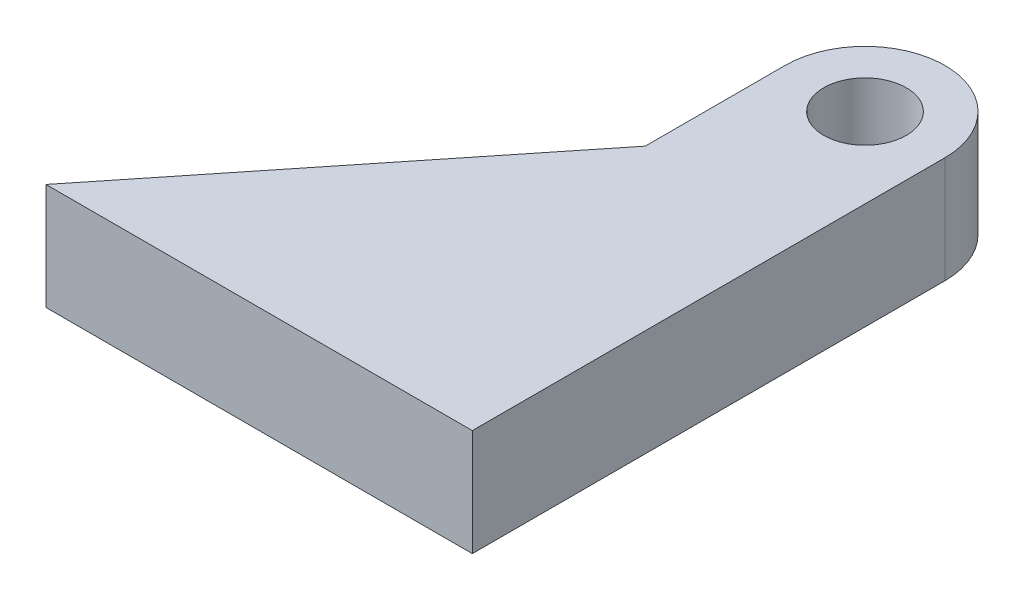
ISO-10303-21;
HEADER;
FILE_DESCRIPTION(('STEP AP214'),'2;1');
FILE_NAME('part.step','',(''),(''),'','','');
FILE_SCHEMA(('AUTOMOTIVE_DESIGN { 1 0 10303 214 1 1 1 1 }'));
ENDSEC;
DATA;
#1=APPLICATION_CONTEXT('core data for automotive mechanical design processes');
#2=APPLICATION_PROTOCOL_DEFINITION('international standard','automotive_design',2000,#1);
#3=PRODUCT_CONTEXT('',#1,'mechanical');
#4=PRODUCT('Part','Part','',(#3));
#5=PRODUCT_RELATED_PRODUCT_CATEGORY('part','',(#4));
#6=PRODUCT_DEFINITION_FORMATION('','',#4);
#7=PRODUCT_DEFINITION_CONTEXT('part definition',#1,'design');
#8=PRODUCT_DEFINITION('design','',#6,#7);
#9=PRODUCT_DEFINITION_SHAPE('','',#8);
#10=(LENGTH_UNIT() NAMED_UNIT(*) SI_UNIT(.MILLI.,.METRE.));
#11=(NAMED_UNIT(*) PLANE_ANGLE_UNIT() SI_UNIT($,.RADIAN.));
#12=(NAMED_UNIT(*) SI_UNIT($,.STERADIAN.) SOLID_ANGLE_UNIT());
#13=UNCERTAINTY_MEASURE_WITH_UNIT(LENGTH_MEASURE(1.E-05),#10,'distance_accuracy_value','');
#14=(GEOMETRIC_REPRESENTATION_CONTEXT(3) GLOBAL_UNCERTAINTY_ASSIGNED_CONTEXT((#13)) GLOBAL_UNIT_ASSIGNED_CONTEXT((#10,
#11,#12)) REPRESENTATION_CONTEXT('',''));
#15=CARTESIAN_POINT('',(0.,0.,0.));
#16=DIRECTION('',(0.,0.,1.));
#17=DIRECTION('',(1.,0.,0.));
#18=AXIS2_PLACEMENT_3D('',#15,#16,#17);
#19=CARTESIAN_POINT('',(0.,20.,0.00397466461664504));
#20=DIRECTION('',(0.,1.,0.));
#21=DIRECTION('',(0.,0.,1.));
#22=AXIS2_PLACEMENT_3D('',#19,#20,#21);
#23=PLANE('',#22);
#24=DIRECTION('',(-0.624933749637742,0.,0.780677787927716));
#25=VECTOR('',#24,1.);
#26=CARTESIAN_POINT('',(-65.0016525273669,20.,88.6924985296004));
#27=LINE('',#26,#25);
#28=CARTESIAN_POINT('',(-15.0069525563476,20.,26.2382754953831));
#29=VERTEX_POINT('',#28);
#30=CARTESIAN_POINT('',(-65.0016525273669,20.,88.6924985296004));
#31=VERTEX_POINT('',#30);
#32=EDGE_CURVE('E116',#29,#31,#27,.T.);
#33=ORIENTED_EDGE('',*,*,#32,.T.);
#34=DIRECTION('',(1.,0.,0.));
#35=VECTOR('',#34,1.);
#36=CARTESIAN_POINT('',(-65.0016525273669,20.,88.6924985296004));
#37=LINE('',#36,#35);
#38=CARTESIAN_POINT('',(15.,20.,88.6924985296004));
#39=VERTEX_POINT('',#38);
#40=EDGE_CURVE('E83',#31,#39,#37,.T.);
#41=ORIENTED_EDGE('',*,*,#40,.T.);
#42=DIRECTION('',(0.,0.,-1.));
#43=VECTOR('',#42,1.);
#44=CARTESIAN_POINT('',(15.,20.,88.6924985296004));
#45=LINE('',#44,#43);
#46=CARTESIAN_POINT('',(15.,20.,0.));
#47=VERTEX_POINT('',#46);
#48=EDGE_CURVE('E87',#39,#47,#45,.T.);
#49=ORIENTED_EDGE('',*,*,#48,.T.);
#50=CARTESIAN_POINT('',(0.,20.,0.00397466461664504));
#51=DIRECTION('',(0.,1.,0.));
#52=DIRECTION('',(0.,0.,1.));
#53=AXIS2_PLACEMENT_3D('',#50,#51,#52);
#54=CIRCLE('',#53,15.0000005265986);
#55=CARTESIAN_POINT('',(-15.,20.,0.));
#56=VERTEX_POINT('',#55);
#57=EDGE_CURVE('E91',#47,#56,#54,.T.);
#58=ORIENTED_EDGE('',*,*,#57,.T.);
#59=DIRECTION('',(-0.00026497763180735,0.,0.999999964893427));
#60=VECTOR('',#59,1.);
#61=CARTESIAN_POINT('',(-15.,20.,0.));
#62=LINE('',#61,#60);
#63=EDGE_CURVE('E49',#56,#29,#62,.T.);
#64=ORIENTED_EDGE('',*,*,#63,.T.);
#65=EDGE_LOOP('',(#33,#41,#49,#58,#64));
#66=FACE_BOUND('',#65,.T.);
#67=CARTESIAN_POINT('',(0.,20.,0.));
#68=DIRECTION('',(0.,1.,0.));
#69=DIRECTION('',(0.,0.,1.));
#70=AXIS2_PLACEMENT_3D('',#67,#68,#69);
#71=CIRCLE('',#70,7.75);
#72=CARTESIAN_POINT('',(0.,20.,7.75));
#73=VERTEX_POINT('',#72);
#74=EDGE_CURVE('E111',#73,#73,#71,.T.);
#75=ORIENTED_EDGE('',*,*,#74,.F.);
#76=EDGE_LOOP('',(#75));
#77=FACE_BOUND('',#76,.T.);
#78=ADVANCED_FACE('F32',(#66,#77),#23,.T.);
#79=CARTESIAN_POINT('',(0.,0.,0.00397466461664504));
#80=DIRECTION('',(0.,1.,0.));
#81=DIRECTION('',(0.,0.,1.));
#82=AXIS2_PLACEMENT_3D('',#79,#80,#81);
#83=PLANE('',#82);
#84=DIRECTION('',(-0.624933749637742,0.,0.780677787927716));
#85=VECTOR('',#84,1.);
#86=CARTESIAN_POINT('',(-65.0016525273669,0.,88.6924985296004));
#87=LINE('',#86,#85);
#88=CARTESIAN_POINT('',(-15.0069525563476,0.,26.2382754953831));
#89=VERTEX_POINT('',#88);
#90=CARTESIAN_POINT('',(-65.0016525273669,0.,88.6924985296004));
#91=VERTEX_POINT('',#90);
#92=EDGE_CURVE('E107',#89,#91,#87,.T.);
#93=ORIENTED_EDGE('',*,*,#92,.F.);
#94=DIRECTION('',(-0.00026497763180735,0.,0.999999964893427));
#95=VECTOR('',#94,1.);
#96=CARTESIAN_POINT('',(-15.,0.,0.));
#97=LINE('',#96,#95);
#98=CARTESIAN_POINT('',(-15.,0.,0.));
#99=VERTEX_POINT('',#98);
#100=EDGE_CURVE('E75',#99,#89,#97,.T.);
#101=ORIENTED_EDGE('',*,*,#100,.F.);
#102=CARTESIAN_POINT('',(0.,0.,0.00397466461664504));
#103=DIRECTION('',(0.,1.,0.));
#104=DIRECTION('',(0.,0.,1.));
#105=AXIS2_PLACEMENT_3D('',#102,#103,#104);
#106=CIRCLE('',#105,15.0000005265986);
#107=CARTESIAN_POINT('',(15.,0.,0.));
#108=VERTEX_POINT('',#107);
#109=EDGE_CURVE('E69',#108,#99,#106,.T.);
#110=ORIENTED_EDGE('',*,*,#109,.F.);
#111=DIRECTION('',(0.,0.,-1.));
#112=VECTOR('',#111,1.);
#113=CARTESIAN_POINT('',(15.,0.,88.6924985296004));
#114=LINE('',#113,#112);
#115=CARTESIAN_POINT('',(15.,0.,88.6924985296004));
#116=VERTEX_POINT('',#115);
#117=EDGE_CURVE('E98',#116,#108,#114,.T.);
#118=ORIENTED_EDGE('',*,*,#117,.F.);
#119=DIRECTION('',(1.,0.,0.));
#120=VECTOR('',#119,1.);
#121=CARTESIAN_POINT('',(-65.0016525273669,0.,88.6924985296004));
#122=LINE('',#121,#120);
#123=EDGE_CURVE('E110',#91,#116,#122,.T.);
#124=ORIENTED_EDGE('',*,*,#123,.F.);
#125=EDGE_LOOP('',(#93,#101,#110,#118,#124));
#126=FACE_BOUND('',#125,.T.);
#127=CARTESIAN_POINT('',(0.,0.,0.));
#128=DIRECTION('',(0.,1.,0.));
#129=DIRECTION('',(0.,0.,1.));
#130=AXIS2_PLACEMENT_3D('',#127,#128,#129);
#131=CIRCLE('',#130,7.75);
#132=CARTESIAN_POINT('',(0.,0.,7.75));
#133=VERTEX_POINT('',#132);
#134=EDGE_CURVE('E196',#133,#133,#131,.T.);
#135=ORIENTED_EDGE('',*,*,#134,.T.);
#136=EDGE_LOOP('',(#135));
#137=FACE_BOUND('',#136,.T.);
#138=ADVANCED_FACE('F120',(#126,#137),#83,.F.);
#139=CARTESIAN_POINT('',(-65.0016525273669,20.,88.6924985296004));
#140=DIRECTION('',(0.780677787927716,0.,0.624933749637742));
#141=DIRECTION('',(0.624933749637742,0.,-0.780677787927716));
#142=AXIS2_PLACEMENT_3D('',#139,#140,#141);
#143=PLANE('',#142);
#144=ORIENTED_EDGE('',*,*,#92,.T.);
#145=DIRECTION('',(0.,-1.,0.));
#146=VECTOR('',#145,1.);
#147=CARTESIAN_POINT('',(-65.0016525273669,20.,88.6924985296004));
#148=LINE('',#147,#146);
#149=EDGE_CURVE('E11',#31,#91,#148,.T.);
#150=ORIENTED_EDGE('',*,*,#149,.F.);
#151=ORIENTED_EDGE('',*,*,#32,.F.);
#152=DIRECTION('',(0.,-1.,0.));
#153=VECTOR('',#152,1.);
#154=CARTESIAN_POINT('',(-15.0069525563476,20.,26.2382754953831));
#155=LINE('',#154,#153);
#156=EDGE_CURVE('E103',#29,#89,#155,.T.);
#157=ORIENTED_EDGE('',*,*,#156,.T.);
#158=EDGE_LOOP('',(#144,#150,#151,#157));
#159=FACE_BOUND('',#158,.T.);
#160=ADVANCED_FACE('F34',(#159),#143,.F.);
#161=CARTESIAN_POINT('',(-65.0016525273669,20.,88.6924985296004));
#162=DIRECTION('',(0.,0.,-1.));
#163=DIRECTION('',(-1.,0.,0.));
#164=AXIS2_PLACEMENT_3D('',#161,#162,#163);
#165=PLANE('',#164);
#166=ORIENTED_EDGE('',*,*,#123,.T.);
#167=DIRECTION('',(0.,-1.,0.));
#168=VECTOR('',#167,1.);
#169=CARTESIAN_POINT('',(15.,20.,88.6924985296004));
#170=LINE('',#169,#168);
#171=EDGE_CURVE('E41',#39,#116,#170,.T.);
#172=ORIENTED_EDGE('',*,*,#171,.F.);
#173=ORIENTED_EDGE('',*,*,#40,.F.);
#174=ORIENTED_EDGE('',*,*,#149,.T.);
#175=EDGE_LOOP('',(#166,#172,#173,#174));
#176=FACE_BOUND('',#175,.T.);
#177=ADVANCED_FACE('F145',(#176),#165,.F.);
#178=CARTESIAN_POINT('',(15.,20.,88.6924985296004));
#179=DIRECTION('',(-1.,0.,0.));
#180=DIRECTION('',(0.,0.,1.));
#181=AXIS2_PLACEMENT_3D('',#178,#179,#180);
#182=PLANE('',#181);
#183=ORIENTED_EDGE('',*,*,#117,.T.);
#184=DIRECTION('',(0.,-1.,0.));
#185=VECTOR('',#184,1.);
#186=CARTESIAN_POINT('',(15.,20.,0.));
#187=LINE('',#186,#185);
#188=EDGE_CURVE('E95',#47,#108,#187,.T.);
#189=ORIENTED_EDGE('',*,*,#188,.F.);
#190=ORIENTED_EDGE('',*,*,#48,.F.);
#191=ORIENTED_EDGE('',*,*,#171,.T.);
#192=EDGE_LOOP('',(#183,#189,#190,#191));
#193=FACE_BOUND('',#192,.T.);
#194=ADVANCED_FACE('F96',(#193),#182,.F.);
#195=CARTESIAN_POINT('',(0.,20.,0.00397466461664504));
#196=DIRECTION('',(0.,-1.,0.));
#197=DIRECTION('',(0.,0.,-1.));
#198=AXIS2_PLACEMENT_3D('',#195,#196,#197);
#199=CYLINDRICAL_SURFACE('',#198,15.0000005265986);
#200=ORIENTED_EDGE('',*,*,#109,.T.);
#201=DIRECTION('',(0.,-1.,0.));
#202=VECTOR('',#201,1.);
#203=CARTESIAN_POINT('',(-15.,20.,0.));
#204=LINE('',#203,#202);
#205=EDGE_CURVE('E99',#56,#99,#204,.T.);
#206=ORIENTED_EDGE('',*,*,#205,.F.);
#207=ORIENTED_EDGE('',*,*,#57,.F.);
#208=ORIENTED_EDGE('',*,*,#188,.T.);
#209=EDGE_LOOP('',(#200,#206,#207,#208));
#210=FACE_BOUND('',#209,.T.);
#211=ADVANCED_FACE('F101',(#210),#199,.T.);
#212=CARTESIAN_POINT('',(-15.,20.,0.));
#213=DIRECTION('',(0.999999964893427,0.,0.00026497763180735));
#214=DIRECTION('',(0.00026497763180735,0.,-0.999999964893427));
#215=AXIS2_PLACEMENT_3D('',#212,#213,#214);
#216=PLANE('',#215);
#217=ORIENTED_EDGE('',*,*,#100,.T.);
#218=ORIENTED_EDGE('',*,*,#156,.F.);
#219=ORIENTED_EDGE('',*,*,#63,.F.);
#220=ORIENTED_EDGE('',*,*,#205,.T.);
#221=EDGE_LOOP('',(#217,#218,#219,#220));
#222=FACE_BOUND('',#221,.T.);
#223=ADVANCED_FACE('F125',(#222),#216,.F.);
#224=CARTESIAN_POINT('',(0.,20.,0.));
#225=DIRECTION('',(0.,-1.,0.));
#226=DIRECTION('',(0.,0.,-1.));
#227=AXIS2_PLACEMENT_3D('',#224,#225,#226);
#228=CYLINDRICAL_SURFACE('',#227,7.75);
#229=ORIENTED_EDGE('',*,*,#74,.T.);
#230=EDGE_LOOP('',(#229));
#231=FACE_BOUND('',#230,.T.);
#232=ORIENTED_EDGE('',*,*,#134,.F.);
#233=EDGE_LOOP('',(#232));
#234=FACE_BOUND('',#233,.T.);
#235=ADVANCED_FACE('F127',(#231,#234),#228,.F.);
#236=CLOSED_SHELL('',(#78,#138,#160,#177,#194,#211,#223,#235));
#237=MANIFOLD_SOLID_BREP('B2',#236);
#238=ADVANCED_BREP_SHAPE_REPRESENTATION('',(#18,#237),#14);
#239=SHAPE_DEFINITION_REPRESENTATION(#9,#238);
ENDSEC;
END-ISO-10303-21;
